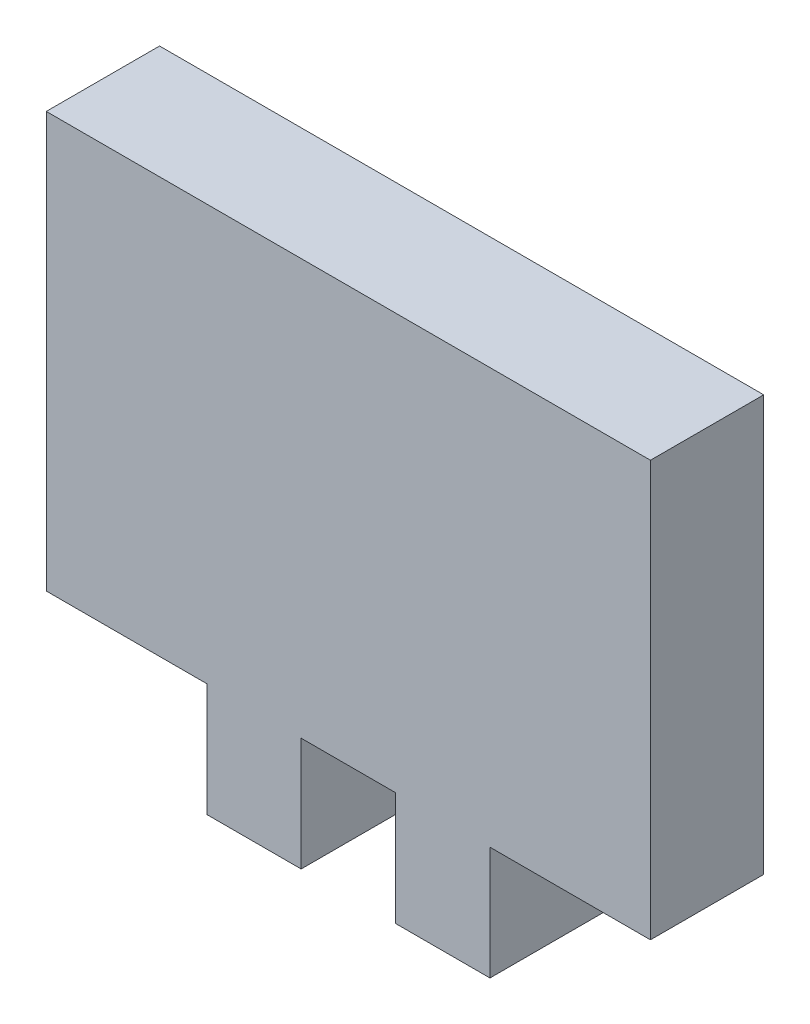
ISO-10303-21;
HEADER;
FILE_DESCRIPTION(('STEP AP214'),'2;1');
FILE_NAME('part.step','',(''),(''),'','','');
FILE_SCHEMA(('AUTOMOTIVE_DESIGN { 1 0 10303 214 1 1 1 1 }'));
ENDSEC;
DATA;
#1=APPLICATION_CONTEXT('core data for automotive mechanical design processes');
#2=APPLICATION_PROTOCOL_DEFINITION('international standard','automotive_design',2000,#1);
#3=PRODUCT_CONTEXT('',#1,'mechanical');
#4=PRODUCT('Part','Part','',(#3));
#5=PRODUCT_RELATED_PRODUCT_CATEGORY('part','',(#4));
#6=PRODUCT_DEFINITION_FORMATION('','',#4);
#7=PRODUCT_DEFINITION_CONTEXT('part definition',#1,'design');
#8=PRODUCT_DEFINITION('design','',#6,#7);
#9=PRODUCT_DEFINITION_SHAPE('','',#8);
#10=(LENGTH_UNIT() NAMED_UNIT(*) SI_UNIT(.MILLI.,.METRE.));
#11=(NAMED_UNIT(*) PLANE_ANGLE_UNIT() SI_UNIT($,.RADIAN.));
#12=(NAMED_UNIT(*) SI_UNIT($,.STERADIAN.) SOLID_ANGLE_UNIT());
#13=UNCERTAINTY_MEASURE_WITH_UNIT(LENGTH_MEASURE(1.E-05),#10,'distance_accuracy_value','');
#14=(GEOMETRIC_REPRESENTATION_CONTEXT(3) GLOBAL_UNCERTAINTY_ASSIGNED_CONTEXT((#13)) GLOBAL_UNIT_ASSIGNED_CONTEXT((#10,
#11,#12)) REPRESENTATION_CONTEXT('',''));
#15=CARTESIAN_POINT('',(0.,0.,0.));
#16=DIRECTION('',(0.,0.,1.));
#17=DIRECTION('',(1.,0.,0.));
#18=AXIS2_PLACEMENT_3D('',#15,#16,#17);
#19=CARTESIAN_POINT('',(0.,22.,6.));
#20=DIRECTION('',(1.,0.,0.));
#21=DIRECTION('',(0.,0.,-1.));
#22=AXIS2_PLACEMENT_3D('',#19,#20,#21);
#23=PLANE('',#22);
#24=DIRECTION('',(0.,-1.,0.));
#25=VECTOR('',#24,1.);
#26=CARTESIAN_POINT('',(0.,22.,0.));
#27=LINE('',#26,#25);
#28=CARTESIAN_POINT('',(0.,22.,0.));
#29=VERTEX_POINT('',#28);
#30=CARTESIAN_POINT('',(0.,0.,0.));
#31=VERTEX_POINT('',#30);
#32=EDGE_CURVE('E153',#29,#31,#27,.T.);
#33=ORIENTED_EDGE('',*,*,#32,.T.);
#34=DIRECTION('',(0.,0.,-1.));
#35=VECTOR('',#34,1.);
#36=CARTESIAN_POINT('',(0.,0.,6.));
#37=LINE('',#36,#35);
#38=CARTESIAN_POINT('',(0.,0.,6.));
#39=VERTEX_POINT('',#38);
#40=EDGE_CURVE('E11',#39,#31,#37,.T.);
#41=ORIENTED_EDGE('',*,*,#40,.F.);
#42=DIRECTION('',(0.,-1.,0.));
#43=VECTOR('',#42,1.);
#44=CARTESIAN_POINT('',(0.,22.,6.));
#45=LINE('',#44,#43);
#46=CARTESIAN_POINT('',(0.,22.,6.));
#47=VERTEX_POINT('',#46);
#48=EDGE_CURVE('E175',#47,#39,#45,.T.);
#49=ORIENTED_EDGE('',*,*,#48,.F.);
#50=DIRECTION('',(0.,0.,-1.));
#51=VECTOR('',#50,1.);
#52=CARTESIAN_POINT('',(0.,22.,6.));
#53=LINE('',#52,#51);
#54=EDGE_CURVE('E149',#47,#29,#53,.T.);
#55=ORIENTED_EDGE('',*,*,#54,.T.);
#56=EDGE_LOOP('',(#33,#41,#49,#55));
#57=FACE_BOUND('',#56,.T.);
#58=ADVANCED_FACE('F33',(#57),#23,.F.);
#59=CARTESIAN_POINT('',(0.,0.,6.));
#60=DIRECTION('',(0.,1.,0.));
#61=DIRECTION('',(0.,0.,1.));
#62=AXIS2_PLACEMENT_3D('',#59,#60,#61);
#63=PLANE('',#62);
#64=DIRECTION('',(1.,0.,0.));
#65=VECTOR('',#64,1.);
#66=CARTESIAN_POINT('',(0.,0.,0.));
#67=LINE('',#66,#65);
#68=CARTESIAN_POINT('',(8.5,0.,0.));
#69=VERTEX_POINT('',#68);
#70=EDGE_CURVE('E156',#31,#69,#67,.T.);
#71=ORIENTED_EDGE('',*,*,#70,.T.);
#72=DIRECTION('',(0.,0.,-1.));
#73=VECTOR('',#72,1.);
#74=CARTESIAN_POINT('',(8.5,0.,6.));
#75=LINE('',#74,#73);
#76=CARTESIAN_POINT('',(8.5,0.,6.));
#77=VERTEX_POINT('',#76);
#78=EDGE_CURVE('E41',#77,#69,#75,.T.);
#79=ORIENTED_EDGE('',*,*,#78,.F.);
#80=DIRECTION('',(1.,0.,0.));
#81=VECTOR('',#80,1.);
#82=CARTESIAN_POINT('',(0.,0.,6.));
#83=LINE('',#82,#81);
#84=EDGE_CURVE('E104',#39,#77,#83,.T.);
#85=ORIENTED_EDGE('',*,*,#84,.F.);
#86=ORIENTED_EDGE('',*,*,#40,.T.);
#87=EDGE_LOOP('',(#71,#79,#85,#86));
#88=FACE_BOUND('',#87,.T.);
#89=ADVANCED_FACE('F253',(#88),#63,.F.);
#90=CARTESIAN_POINT('',(8.5,0.,6.));
#91=DIRECTION('',(1.,0.,0.));
#92=DIRECTION('',(0.,1.,0.));
#93=AXIS2_PLACEMENT_3D('',#90,#91,#92);
#94=PLANE('',#93);
#95=DIRECTION('',(0.,-1.,0.));
#96=VECTOR('',#95,1.);
#97=CARTESIAN_POINT('',(8.5,0.,0.));
#98=LINE('',#97,#96);
#99=CARTESIAN_POINT('',(8.5,-6.,0.));
#100=VERTEX_POINT('',#99);
#101=EDGE_CURVE('E158',#69,#100,#98,.T.);
#102=ORIENTED_EDGE('',*,*,#101,.T.);
#103=DIRECTION('',(0.,0.,-1.));
#104=VECTOR('',#103,1.);
#105=CARTESIAN_POINT('',(8.5,-6.,6.));
#106=LINE('',#105,#104);
#107=CARTESIAN_POINT('',(8.5,-6.,6.));
#108=VERTEX_POINT('',#107);
#109=EDGE_CURVE('E194',#108,#100,#106,.T.);
#110=ORIENTED_EDGE('',*,*,#109,.F.);
#111=DIRECTION('',(0.,-1.,0.));
#112=VECTOR('',#111,1.);
#113=CARTESIAN_POINT('',(8.5,0.,6.));
#114=LINE('',#113,#112);
#115=EDGE_CURVE('E202',#77,#108,#114,.T.);
#116=ORIENTED_EDGE('',*,*,#115,.F.);
#117=ORIENTED_EDGE('',*,*,#78,.T.);
#118=EDGE_LOOP('',(#102,#110,#116,#117));
#119=FACE_BOUND('',#118,.T.);
#120=ADVANCED_FACE('F200',(#119),#94,.F.);
#121=CARTESIAN_POINT('',(8.5,-6.,6.));
#122=DIRECTION('',(0.,1.,0.));
#123=DIRECTION('',(0.,0.,1.));
#124=AXIS2_PLACEMENT_3D('',#121,#122,#123);
#125=PLANE('',#124);
#126=DIRECTION('',(1.,0.,0.));
#127=VECTOR('',#126,1.);
#128=CARTESIAN_POINT('',(8.5,-6.,0.));
#129=LINE('',#128,#127);
#130=CARTESIAN_POINT('',(13.5,-6.,0.));
#131=VERTEX_POINT('',#130);
#132=EDGE_CURVE('E160',#100,#131,#129,.T.);
#133=ORIENTED_EDGE('',*,*,#132,.T.);
#134=DIRECTION('',(0.,0.,-1.));
#135=VECTOR('',#134,1.);
#136=CARTESIAN_POINT('',(13.5,-6.,6.));
#137=LINE('',#136,#135);
#138=CARTESIAN_POINT('',(13.5,-6.,6.));
#139=VERTEX_POINT('',#138);
#140=EDGE_CURVE('E191',#139,#131,#137,.T.);
#141=ORIENTED_EDGE('',*,*,#140,.F.);
#142=DIRECTION('',(1.,0.,0.));
#143=VECTOR('',#142,1.);
#144=CARTESIAN_POINT('',(8.5,-6.,6.));
#145=LINE('',#144,#143);
#146=EDGE_CURVE('E220',#108,#139,#145,.T.);
#147=ORIENTED_EDGE('',*,*,#146,.F.);
#148=ORIENTED_EDGE('',*,*,#109,.T.);
#149=EDGE_LOOP('',(#133,#141,#147,#148));
#150=FACE_BOUND('',#149,.T.);
#151=ADVANCED_FACE('F211',(#150),#125,.F.);
#152=CARTESIAN_POINT('',(13.5,-6.,6.));
#153=DIRECTION('',(-1.,0.,0.));
#154=DIRECTION('',(0.,0.,1.));
#155=AXIS2_PLACEMENT_3D('',#152,#153,#154);
#156=PLANE('',#155);
#157=DIRECTION('',(0.,1.,0.));
#158=VECTOR('',#157,1.);
#159=CARTESIAN_POINT('',(13.5,-6.,0.));
#160=LINE('',#159,#158);
#161=CARTESIAN_POINT('',(13.5,0.,0.));
#162=VERTEX_POINT('',#161);
#163=EDGE_CURVE('E162',#131,#162,#160,.T.);
#164=ORIENTED_EDGE('',*,*,#163,.T.);
#165=DIRECTION('',(0.,0.,-1.));
#166=VECTOR('',#165,1.);
#167=CARTESIAN_POINT('',(13.5,0.,6.));
#168=LINE('',#167,#166);
#169=CARTESIAN_POINT('',(13.5,0.,6.));
#170=VERTEX_POINT('',#169);
#171=EDGE_CURVE('E188',#170,#162,#168,.T.);
#172=ORIENTED_EDGE('',*,*,#171,.F.);
#173=DIRECTION('',(0.,1.,0.));
#174=VECTOR('',#173,1.);
#175=CARTESIAN_POINT('',(13.5,-6.,6.));
#176=LINE('',#175,#174);
#177=EDGE_CURVE('E217',#139,#170,#176,.T.);
#178=ORIENTED_EDGE('',*,*,#177,.F.);
#179=ORIENTED_EDGE('',*,*,#140,.T.);
#180=EDGE_LOOP('',(#164,#172,#178,#179));
#181=FACE_BOUND('',#180,.T.);
#182=ADVANCED_FACE('F215',(#181),#156,.F.);
#183=CARTESIAN_POINT('',(13.5,0.,6.));
#184=DIRECTION('',(0.,1.,0.));
#185=DIRECTION('',(0.,0.,1.));
#186=AXIS2_PLACEMENT_3D('',#183,#184,#185);
#187=PLANE('',#186);
#188=DIRECTION('',(1.,0.,0.));
#189=VECTOR('',#188,1.);
#190=CARTESIAN_POINT('',(13.5,0.,0.));
#191=LINE('',#190,#189);
#192=CARTESIAN_POINT('',(18.5,0.,0.));
#193=VERTEX_POINT('',#192);
#194=EDGE_CURVE('E164',#162,#193,#191,.T.);
#195=ORIENTED_EDGE('',*,*,#194,.T.);
#196=DIRECTION('',(0.,0.,-1.));
#197=VECTOR('',#196,1.);
#198=CARTESIAN_POINT('',(18.5,0.,6.));
#199=LINE('',#198,#197);
#200=CARTESIAN_POINT('',(18.5,0.,6.));
#201=VERTEX_POINT('',#200);
#202=EDGE_CURVE('E185',#201,#193,#199,.T.);
#203=ORIENTED_EDGE('',*,*,#202,.F.);
#204=DIRECTION('',(1.,0.,0.));
#205=VECTOR('',#204,1.);
#206=CARTESIAN_POINT('',(13.5,0.,6.));
#207=LINE('',#206,#205);
#208=EDGE_CURVE('E219',#170,#201,#207,.T.);
#209=ORIENTED_EDGE('',*,*,#208,.F.);
#210=ORIENTED_EDGE('',*,*,#171,.T.);
#211=EDGE_LOOP('',(#195,#203,#209,#210));
#212=FACE_BOUND('',#211,.T.);
#213=ADVANCED_FACE('F266',(#212),#187,.F.);
#214=CARTESIAN_POINT('',(18.5,0.,6.));
#215=DIRECTION('',(1.,0.,0.));
#216=DIRECTION('',(0.,0.,-1.));
#217=AXIS2_PLACEMENT_3D('',#214,#215,#216);
#218=PLANE('',#217);
#219=DIRECTION('',(0.,-1.,0.));
#220=VECTOR('',#219,1.);
#221=CARTESIAN_POINT('',(18.5,0.,0.));
#222=LINE('',#221,#220);
#223=CARTESIAN_POINT('',(18.5,-6.,0.));
#224=VERTEX_POINT('',#223);
#225=EDGE_CURVE('E166',#193,#224,#222,.T.);
#226=ORIENTED_EDGE('',*,*,#225,.T.);
#227=DIRECTION('',(0.,0.,-1.));
#228=VECTOR('',#227,1.);
#229=CARTESIAN_POINT('',(18.5,-6.,6.));
#230=LINE('',#229,#228);
#231=CARTESIAN_POINT('',(18.5,-6.,6.));
#232=VERTEX_POINT('',#231);
#233=EDGE_CURVE('E182',#232,#224,#230,.T.);
#234=ORIENTED_EDGE('',*,*,#233,.F.);
#235=DIRECTION('',(0.,-1.,0.));
#236=VECTOR('',#235,1.);
#237=CARTESIAN_POINT('',(18.5,0.,6.));
#238=LINE('',#237,#236);
#239=EDGE_CURVE('E222',#201,#232,#238,.T.);
#240=ORIENTED_EDGE('',*,*,#239,.F.);
#241=ORIENTED_EDGE('',*,*,#202,.T.);
#242=EDGE_LOOP('',(#226,#234,#240,#241));
#243=FACE_BOUND('',#242,.T.);
#244=ADVANCED_FACE('F269',(#243),#218,.F.);
#245=CARTESIAN_POINT('',(18.5,-6.,6.));
#246=DIRECTION('',(0.,1.,0.));
#247=DIRECTION('',(0.,0.,1.));
#248=AXIS2_PLACEMENT_3D('',#245,#246,#247);
#249=PLANE('',#248);
#250=DIRECTION('',(1.,0.,0.));
#251=VECTOR('',#250,1.);
#252=CARTESIAN_POINT('',(18.5,-6.,0.));
#253=LINE('',#252,#251);
#254=CARTESIAN_POINT('',(23.5,-6.,0.));
#255=VERTEX_POINT('',#254);
#256=EDGE_CURVE('E168',#224,#255,#253,.T.);
#257=ORIENTED_EDGE('',*,*,#256,.T.);
#258=DIRECTION('',(0.,0.,-1.));
#259=VECTOR('',#258,1.);
#260=CARTESIAN_POINT('',(23.5,-6.,6.));
#261=LINE('',#260,#259);
#262=CARTESIAN_POINT('',(23.5,-6.,6.));
#263=VERTEX_POINT('',#262);
#264=EDGE_CURVE('E179',#263,#255,#261,.T.);
#265=ORIENTED_EDGE('',*,*,#264,.F.);
#266=DIRECTION('',(1.,0.,0.));
#267=VECTOR('',#266,1.);
#268=CARTESIAN_POINT('',(18.5,-6.,6.));
#269=LINE('',#268,#267);
#270=EDGE_CURVE('E228',#232,#263,#269,.T.);
#271=ORIENTED_EDGE('',*,*,#270,.F.);
#272=ORIENTED_EDGE('',*,*,#233,.T.);
#273=EDGE_LOOP('',(#257,#265,#271,#272));
#274=FACE_BOUND('',#273,.T.);
#275=ADVANCED_FACE('F234',(#274),#249,.F.);
#276=CARTESIAN_POINT('',(23.5,-6.,6.));
#277=DIRECTION('',(-1.,0.,0.));
#278=DIRECTION('',(0.,0.,1.));
#279=AXIS2_PLACEMENT_3D('',#276,#277,#278);
#280=PLANE('',#279);
#281=DIRECTION('',(0.,1.,0.));
#282=VECTOR('',#281,1.);
#283=CARTESIAN_POINT('',(23.5,-6.,0.));
#284=LINE('',#283,#282);
#285=CARTESIAN_POINT('',(23.5,0.,0.));
#286=VERTEX_POINT('',#285);
#287=EDGE_CURVE('E170',#255,#286,#284,.T.);
#288=ORIENTED_EDGE('',*,*,#287,.T.);
#289=DIRECTION('',(0.,0.,-1.));
#290=VECTOR('',#289,1.);
#291=CARTESIAN_POINT('',(23.5,0.,6.));
#292=LINE('',#291,#290);
#293=CARTESIAN_POINT('',(23.5,0.,6.));
#294=VERTEX_POINT('',#293);
#295=EDGE_CURVE('E144',#294,#286,#292,.T.);
#296=ORIENTED_EDGE('',*,*,#295,.F.);
#297=DIRECTION('',(0.,1.,0.));
#298=VECTOR('',#297,1.);
#299=CARTESIAN_POINT('',(23.5,-6.,6.));
#300=LINE('',#299,#298);
#301=EDGE_CURVE('E135',#263,#294,#300,.T.);
#302=ORIENTED_EDGE('',*,*,#301,.F.);
#303=ORIENTED_EDGE('',*,*,#264,.T.);
#304=EDGE_LOOP('',(#288,#296,#302,#303));
#305=FACE_BOUND('',#304,.T.);
#306=ADVANCED_FACE('F238',(#305),#280,.F.);
#307=CARTESIAN_POINT('',(23.5,0.,6.));
#308=DIRECTION('',(0.,1.,0.));
#309=DIRECTION('',(0.,0.,1.));
#310=AXIS2_PLACEMENT_3D('',#307,#308,#309);
#311=PLANE('',#310);
#312=DIRECTION('',(1.,0.,0.));
#313=VECTOR('',#312,1.);
#314=CARTESIAN_POINT('',(23.5,0.,0.));
#315=LINE('',#314,#313);
#316=CARTESIAN_POINT('',(32.,0.,0.));
#317=VERTEX_POINT('',#316);
#318=EDGE_CURVE('E143',#286,#317,#315,.T.);
#319=ORIENTED_EDGE('',*,*,#318,.T.);
#320=DIRECTION('',(0.,0.,-1.));
#321=VECTOR('',#320,1.);
#322=CARTESIAN_POINT('',(32.,0.,6.));
#323=LINE('',#322,#321);
#324=CARTESIAN_POINT('',(32.,0.,6.));
#325=VERTEX_POINT('',#324);
#326=EDGE_CURVE('E140',#325,#317,#323,.T.);
#327=ORIENTED_EDGE('',*,*,#326,.F.);
#328=DIRECTION('',(1.,0.,0.));
#329=VECTOR('',#328,1.);
#330=CARTESIAN_POINT('',(23.5,0.,6.));
#331=LINE('',#330,#329);
#332=EDGE_CURVE('E129',#294,#325,#331,.T.);
#333=ORIENTED_EDGE('',*,*,#332,.F.);
#334=ORIENTED_EDGE('',*,*,#295,.T.);
#335=EDGE_LOOP('',(#319,#327,#333,#334));
#336=FACE_BOUND('',#335,.T.);
#337=ADVANCED_FACE('F141',(#336),#311,.F.);
#338=CARTESIAN_POINT('',(32.,0.,6.));
#339=DIRECTION('',(-1.,0.,0.));
#340=DIRECTION('',(0.,0.,1.));
#341=AXIS2_PLACEMENT_3D('',#338,#339,#340);
#342=PLANE('',#341);
#343=DIRECTION('',(0.,1.,0.));
#344=VECTOR('',#343,1.);
#345=CARTESIAN_POINT('',(32.,0.,0.));
#346=LINE('',#345,#344);
#347=CARTESIAN_POINT('',(32.,22.,0.));
#348=VERTEX_POINT('',#347);
#349=EDGE_CURVE('E90',#317,#348,#346,.T.);
#350=ORIENTED_EDGE('',*,*,#349,.T.);
#351=DIRECTION('',(0.,0.,-1.));
#352=VECTOR('',#351,1.);
#353=CARTESIAN_POINT('',(32.,22.,6.));
#354=LINE('',#353,#352);
#355=CARTESIAN_POINT('',(32.,22.,6.));
#356=VERTEX_POINT('',#355);
#357=EDGE_CURVE('E145',#356,#348,#354,.T.);
#358=ORIENTED_EDGE('',*,*,#357,.F.);
#359=DIRECTION('',(0.,1.,0.));
#360=VECTOR('',#359,1.);
#361=CARTESIAN_POINT('',(32.,0.,6.));
#362=LINE('',#361,#360);
#363=EDGE_CURVE('E133',#325,#356,#362,.T.);
#364=ORIENTED_EDGE('',*,*,#363,.F.);
#365=ORIENTED_EDGE('',*,*,#326,.T.);
#366=EDGE_LOOP('',(#350,#358,#364,#365));
#367=FACE_BOUND('',#366,.T.);
#368=ADVANCED_FACE('F147',(#367),#342,.F.);
#369=CARTESIAN_POINT('',(32.,22.,6.));
#370=DIRECTION('',(0.,-1.,0.));
#371=DIRECTION('',(1.,0.,0.));
#372=AXIS2_PLACEMENT_3D('',#369,#370,#371);
#373=PLANE('',#372);
#374=DIRECTION('',(-1.,0.,0.));
#375=VECTOR('',#374,1.);
#376=CARTESIAN_POINT('',(32.,22.,0.));
#377=LINE('',#376,#375);
#378=EDGE_CURVE('E96',#348,#29,#377,.T.);
#379=ORIENTED_EDGE('',*,*,#378,.T.);
#380=ORIENTED_EDGE('',*,*,#54,.F.);
#381=DIRECTION('',(-1.,0.,0.));
#382=VECTOR('',#381,1.);
#383=CARTESIAN_POINT('',(32.,22.,6.));
#384=LINE('',#383,#382);
#385=EDGE_CURVE('E49',#356,#47,#384,.T.);
#386=ORIENTED_EDGE('',*,*,#385,.F.);
#387=ORIENTED_EDGE('',*,*,#357,.T.);
#388=EDGE_LOOP('',(#379,#380,#386,#387));
#389=FACE_BOUND('',#388,.T.);
#390=ADVANCED_FACE('F242',(#389),#373,.F.);
#391=CARTESIAN_POINT('',(0.,0.,6.));
#392=DIRECTION('',(0.,0.,1.));
#393=DIRECTION('',(1.,0.,0.));
#394=AXIS2_PLACEMENT_3D('',#391,#392,#393);
#395=PLANE('',#394);
#396=ORIENTED_EDGE('',*,*,#48,.T.);
#397=ORIENTED_EDGE('',*,*,#84,.T.);
#398=ORIENTED_EDGE('',*,*,#115,.T.);
#399=ORIENTED_EDGE('',*,*,#146,.T.);
#400=ORIENTED_EDGE('',*,*,#177,.T.);
#401=ORIENTED_EDGE('',*,*,#208,.T.);
#402=ORIENTED_EDGE('',*,*,#239,.T.);
#403=ORIENTED_EDGE('',*,*,#270,.T.);
#404=ORIENTED_EDGE('',*,*,#301,.T.);
#405=ORIENTED_EDGE('',*,*,#332,.T.);
#406=ORIENTED_EDGE('',*,*,#363,.T.);
#407=ORIENTED_EDGE('',*,*,#385,.T.);
#408=EDGE_LOOP('',(#396,#397,#398,#399,#400,#401,#402,#403,#404,#405,#406,#407));
#409=FACE_BOUND('',#408,.T.);
#410=ADVANCED_FACE('F131',(#409),#395,.T.);
#411=CARTESIAN_POINT('',(0.,0.,0.));
#412=DIRECTION('',(0.,0.,1.));
#413=DIRECTION('',(1.,0.,0.));
#414=AXIS2_PLACEMENT_3D('',#411,#412,#413);
#415=PLANE('',#414);
#416=ORIENTED_EDGE('',*,*,#32,.F.);
#417=ORIENTED_EDGE('',*,*,#378,.F.);
#418=ORIENTED_EDGE('',*,*,#349,.F.);
#419=ORIENTED_EDGE('',*,*,#318,.F.);
#420=ORIENTED_EDGE('',*,*,#287,.F.);
#421=ORIENTED_EDGE('',*,*,#256,.F.);
#422=ORIENTED_EDGE('',*,*,#225,.F.);
#423=ORIENTED_EDGE('',*,*,#194,.F.);
#424=ORIENTED_EDGE('',*,*,#163,.F.);
#425=ORIENTED_EDGE('',*,*,#132,.F.);
#426=ORIENTED_EDGE('',*,*,#101,.F.);
#427=ORIENTED_EDGE('',*,*,#70,.F.);
#428=EDGE_LOOP('',(#416,#417,#418,#419,#420,#421,#422,#423,#424,#425,#426,#427));
#429=FACE_BOUND('',#428,.T.);
#430=ADVANCED_FACE('F206',(#429),#415,.F.);
#431=CLOSED_SHELL('',(#58,#89,#120,#151,#182,#213,#244,#275,#306,#337,#368,#390,#410,#430));
#432=MANIFOLD_SOLID_BREP('B2',#431);
#433=ADVANCED_BREP_SHAPE_REPRESENTATION('',(#18,#432),#14);
#434=SHAPE_DEFINITION_REPRESENTATION(#9,#433);
ENDSEC;
END-ISO-10303-21;
